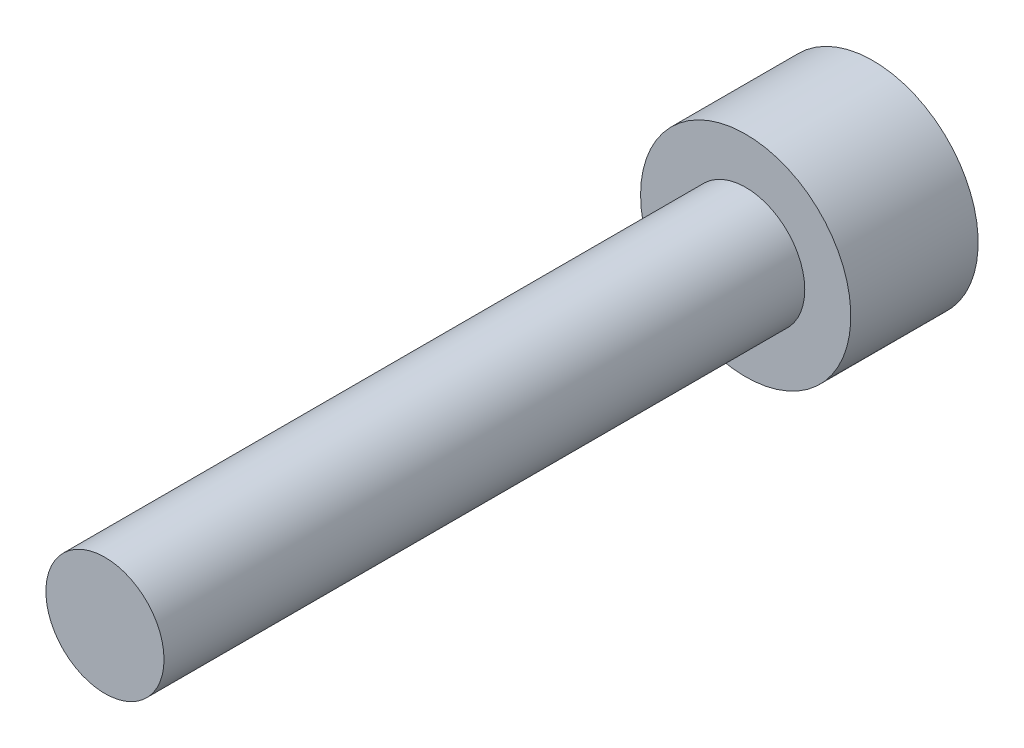
ISO-10303-21;
HEADER;
FILE_DESCRIPTION(('STEP AP214'),'2;1');
FILE_NAME('part.step','',(''),(''),'','','');
FILE_SCHEMA(('AUTOMOTIVE_DESIGN { 1 0 10303 214 1 1 1 1 }'));
ENDSEC;
DATA;
#1=APPLICATION_CONTEXT('core data for automotive mechanical design processes');
#2=APPLICATION_PROTOCOL_DEFINITION('international standard','automotive_design',2000,#1);
#3=PRODUCT_CONTEXT('',#1,'mechanical');
#4=PRODUCT('Part','Part','',(#3));
#5=PRODUCT_RELATED_PRODUCT_CATEGORY('part','',(#4));
#6=PRODUCT_DEFINITION_FORMATION('','',#4);
#7=PRODUCT_DEFINITION_CONTEXT('part definition',#1,'design');
#8=PRODUCT_DEFINITION('design','',#6,#7);
#9=PRODUCT_DEFINITION_SHAPE('','',#8);
#10=(LENGTH_UNIT() NAMED_UNIT(*) SI_UNIT(.MILLI.,.METRE.));
#11=(NAMED_UNIT(*) PLANE_ANGLE_UNIT() SI_UNIT($,.RADIAN.));
#12=(NAMED_UNIT(*) SI_UNIT($,.STERADIAN.) SOLID_ANGLE_UNIT());
#13=UNCERTAINTY_MEASURE_WITH_UNIT(LENGTH_MEASURE(1.E-05),#10,'distance_accuracy_value','');
#14=(GEOMETRIC_REPRESENTATION_CONTEXT(3) GLOBAL_UNCERTAINTY_ASSIGNED_CONTEXT((#13)) GLOBAL_UNIT_ASSIGNED_CONTEXT((#10,
#11,#12)) REPRESENTATION_CONTEXT('',''));
#15=CARTESIAN_POINT('',(0.,0.,0.));
#16=DIRECTION('',(0.,0.,1.));
#17=DIRECTION('',(1.,0.,0.));
#18=AXIS2_PLACEMENT_3D('',#15,#16,#17);
#19=CARTESIAN_POINT('',(0.,0.,3.18));
#20=DIRECTION('',(0.,0.,-1.));
#21=DIRECTION('',(-1.,0.,0.));
#22=AXIS2_PLACEMENT_3D('',#19,#20,#21);
#23=CYLINDRICAL_SURFACE('',#22,2.625);
#24=CARTESIAN_POINT('',(0.,0.,3.18));
#25=DIRECTION('',(0.,0.,1.));
#26=DIRECTION('',(1.,0.,0.));
#27=AXIS2_PLACEMENT_3D('',#24,#25,#26);
#28=CIRCLE('',#27,2.625);
#29=CARTESIAN_POINT('',(-2.625,0.,3.18));
#30=VERTEX_POINT('',#29);
#31=EDGE_CURVE('E42',#30,#30,#28,.T.);
#32=CARTESIAN_POINT('',(0.,0.,0.));
#33=DIRECTION('',(0.,0.,1.));
#34=DIRECTION('',(1.,0.,0.));
#35=AXIS2_PLACEMENT_3D('',#32,#33,#34);
#36=CIRCLE('',#35,2.625);
#37=CARTESIAN_POINT('',(-2.625,0.,0.));
#38=VERTEX_POINT('',#37);
#39=EDGE_CURVE('E38',#38,#38,#36,.T.);
#40=CARTESIAN_POINT('',(-2.625,0.,3.18));
#41=CARTESIAN_POINT('',(-2.625,0.,3.146875));
#42=CARTESIAN_POINT('',(-2.625,0.,3.11375));
#43=CARTESIAN_POINT('',(-2.625,0.,3.0475));
#44=CARTESIAN_POINT('',(-2.625,0.,3.014375));
#45=CARTESIAN_POINT('',(-2.625,0.,2.948125));
#46=CARTESIAN_POINT('',(-2.625,0.,2.915));
#47=CARTESIAN_POINT('',(-2.625,0.,2.84875));
#48=CARTESIAN_POINT('',(-2.625,0.,2.815625));
#49=CARTESIAN_POINT('',(-2.625,0.,2.749375));
#50=CARTESIAN_POINT('',(-2.625,0.,2.71625));
#51=CARTESIAN_POINT('',(-2.625,0.,2.65));
#52=CARTESIAN_POINT('',(-2.625,0.,2.616875));
#53=CARTESIAN_POINT('',(-2.625,0.,2.550625));
#54=CARTESIAN_POINT('',(-2.625,0.,2.5175));
#55=CARTESIAN_POINT('',(-2.625,0.,2.45125));
#56=CARTESIAN_POINT('',(-2.625,0.,2.418125));
#57=CARTESIAN_POINT('',(-2.625,0.,2.351875));
#58=CARTESIAN_POINT('',(-2.625,0.,2.31875));
#59=CARTESIAN_POINT('',(-2.625,0.,2.2525));
#60=CARTESIAN_POINT('',(-2.625,0.,2.219375));
#61=CARTESIAN_POINT('',(-2.625,0.,2.153125));
#62=CARTESIAN_POINT('',(-2.625,0.,2.12));
#63=CARTESIAN_POINT('',(-2.625,0.,2.05375));
#64=CARTESIAN_POINT('',(-2.625,0.,2.020625));
#65=CARTESIAN_POINT('',(-2.625,0.,1.954375));
#66=CARTESIAN_POINT('',(-2.625,0.,1.92125));
#67=CARTESIAN_POINT('',(-2.625,0.,1.855));
#68=CARTESIAN_POINT('',(-2.625,0.,1.821875));
#69=CARTESIAN_POINT('',(-2.625,0.,1.755625));
#70=CARTESIAN_POINT('',(-2.625,0.,1.7225));
#71=CARTESIAN_POINT('',(-2.625,0.,1.65625));
#72=CARTESIAN_POINT('',(-2.625,0.,1.623125));
#73=CARTESIAN_POINT('',(-2.625,0.,1.556875));
#74=CARTESIAN_POINT('',(-2.625,0.,1.52375));
#75=CARTESIAN_POINT('',(-2.625,0.,1.4575));
#76=CARTESIAN_POINT('',(-2.625,0.,1.424375));
#77=CARTESIAN_POINT('',(-2.625,0.,1.358125));
#78=CARTESIAN_POINT('',(-2.625,0.,1.325));
#79=CARTESIAN_POINT('',(-2.625,0.,1.25875));
#80=CARTESIAN_POINT('',(-2.625,0.,1.225625));
#81=CARTESIAN_POINT('',(-2.625,0.,1.159375));
#82=CARTESIAN_POINT('',(-2.625,0.,1.12625));
#83=CARTESIAN_POINT('',(-2.625,0.,1.06));
#84=CARTESIAN_POINT('',(-2.625,0.,1.026875));
#85=CARTESIAN_POINT('',(-2.625,0.,0.960625));
#86=CARTESIAN_POINT('',(-2.625,0.,0.9275));
#87=CARTESIAN_POINT('',(-2.625,0.,0.86125));
#88=CARTESIAN_POINT('',(-2.625,0.,0.828125));
#89=CARTESIAN_POINT('',(-2.625,0.,0.761875));
#90=CARTESIAN_POINT('',(-2.625,0.,0.72875));
#91=CARTESIAN_POINT('',(-2.625,0.,0.6625));
#92=CARTESIAN_POINT('',(-2.625,0.,0.629375));
#93=CARTESIAN_POINT('',(-2.625,0.,0.563125));
#94=CARTESIAN_POINT('',(-2.625,0.,0.53));
#95=CARTESIAN_POINT('',(-2.625,0.,0.46375));
#96=CARTESIAN_POINT('',(-2.625,0.,0.430625));
#97=CARTESIAN_POINT('',(-2.625,0.,0.364375));
#98=CARTESIAN_POINT('',(-2.625,0.,0.33125));
#99=CARTESIAN_POINT('',(-2.625,0.,0.265));
#100=CARTESIAN_POINT('',(-2.625,0.,0.231875));
#101=CARTESIAN_POINT('',(-2.625,0.,0.165625));
#102=CARTESIAN_POINT('',(-2.625,0.,0.1325));
#103=CARTESIAN_POINT('',(-2.625,0.,0.06625));
#104=CARTESIAN_POINT('',(-2.625,0.,0.033125));
#105=CARTESIAN_POINT('',(-2.625,0.,0.));
#106=B_SPLINE_CURVE_WITH_KNOTS('',3,(#40,#41,#42,#43,#44,#45,#46,#47,#48,#49,#50,#51,#52,#53,
#54,#55,#56,#57,#58,#59,#60,#61,#62,#63,#64,#65,#66,#67,#68,#69,#70,#71,#72,#73,#74,#75,#76,#77,
#78,#79,#80,#81,#82,#83,#84,#85,#86,#87,#88,#89,#90,#91,#92,#93,#94,#95,#96,#97,#98,#99,#100,
#101,#102,#103,#104,#105),.UNSPECIFIED.,.F.,.F.,(4,2,2,2,2,2,2,2,2,2,2,2,2,2,2,2,2,2,2,2,2,2,2,
2,2,2,2,2,2,2,2,2,4),(0.,0.0993749999999996,0.19875,0.298125,0.3975,0.496875,0.59625,0.695625,
0.795,0.894375,0.99375,1.093125,1.1925,1.291875,1.39125,1.490625,1.59,1.689375,1.78875,1.888125,
1.9875,2.086875,2.18625,2.285625,2.385,2.484375,2.58375,2.683125,2.7825,2.881875,2.98125,
3.080625,3.18),.UNSPECIFIED.);
#107=EDGE_CURVE('BSEAM35',#30,#38,#106,.T.);
#108=ORIENTED_EDGE('',*,*,#31,.F.);
#109=ORIENTED_EDGE('',*,*,#39,.T.);
#110=ORIENTED_EDGE('',*,*,#107,.T.);
#111=ORIENTED_EDGE('',*,*,#107,.F.);
#112=EDGE_LOOP('',(#108,#110,#109,#111));
#113=FACE_BOUND('',#112,.T.);
#114=ADVANCED_FACE('F35',(#113),#23,.T.);
#115=CARTESIAN_POINT('',(0.,0.,3.18));
#116=DIRECTION('',(0.,0.,1.));
#117=DIRECTION('',(1.,0.,0.));
#118=AXIS2_PLACEMENT_3D('',#115,#116,#117);
#119=PLANE('',#118);
#120=CARTESIAN_POINT('',(0.,0.,3.18));
#121=DIRECTION('',(0.,0.,1.));
#122=DIRECTION('',(1.,0.,0.));
#123=AXIS2_PLACEMENT_3D('',#120,#121,#122);
#124=CIRCLE('',#123,1.475);
#125=CARTESIAN_POINT('',(1.475,0.,3.18));
#126=VERTEX_POINT('',#125);
#127=EDGE_CURVE('E10',#126,#126,#124,.T.);
#128=ORIENTED_EDGE('',*,*,#127,.F.);
#129=EDGE_LOOP('',(#128));
#130=FACE_BOUND('',#129,.T.);
#131=ORIENTED_EDGE('',*,*,#31,.T.);
#132=EDGE_LOOP('',(#131));
#133=FACE_BOUND('',#132,.T.);
#134=ADVANCED_FACE('F59',(#130,#133),#119,.T.);
#135=CARTESIAN_POINT('',(0.,0.,0.));
#136=DIRECTION('',(0.,0.,1.));
#137=DIRECTION('',(1.,0.,0.));
#138=AXIS2_PLACEMENT_3D('',#135,#136,#137);
#139=PLANE('',#138);
#140=ORIENTED_EDGE('',*,*,#39,.F.);
#141=EDGE_LOOP('',(#140));
#142=FACE_BOUND('',#141,.T.);
#143=ADVANCED_FACE('F56',(#142),#139,.F.);
#144=CARTESIAN_POINT('',(0.,0.,19.18));
#145=DIRECTION('',(0.,0.,-1.));
#146=DIRECTION('',(-1.,0.,0.));
#147=AXIS2_PLACEMENT_3D('',#144,#145,#146);
#148=CYLINDRICAL_SURFACE('',#147,1.475);
#149=CARTESIAN_POINT('',(0.,0.,19.18));
#150=DIRECTION('',(0.,0.,1.));
#151=DIRECTION('',(1.,0.,0.));
#152=AXIS2_PLACEMENT_3D('',#149,#150,#151);
#153=CIRCLE('',#152,1.475);
#154=CARTESIAN_POINT('',(1.475,0.,19.18));
#155=VERTEX_POINT('',#154);
#156=EDGE_CURVE('E48',#155,#155,#153,.T.);
#157=ORIENTED_EDGE('',*,*,#156,.F.);
#158=EDGE_LOOP('',(#157));
#159=FACE_BOUND('',#158,.T.);
#160=ORIENTED_EDGE('',*,*,#127,.T.);
#161=EDGE_LOOP('',(#160));
#162=FACE_BOUND('',#161,.T.);
#163=ADVANCED_FACE('F58',(#159,#162),#148,.T.);
#164=CARTESIAN_POINT('',(0.,0.,19.18));
#165=DIRECTION('',(0.,0.,1.));
#166=DIRECTION('',(1.,0.,0.));
#167=AXIS2_PLACEMENT_3D('',#164,#165,#166);
#168=PLANE('',#167);
#169=ORIENTED_EDGE('',*,*,#156,.T.);
#170=EDGE_LOOP('',(#169));
#171=FACE_BOUND('',#170,.T.);
#172=ADVANCED_FACE('F64',(#171),#168,.T.);
#173=CLOSED_SHELL('',(#114,#134,#143,#163,#172));
#174=MANIFOLD_SOLID_BREP('B2',#173);
#175=ADVANCED_BREP_SHAPE_REPRESENTATION('',(#18,#174),#14);
#176=SHAPE_DEFINITION_REPRESENTATION(#9,#175);
ENDSEC;
END-ISO-10303-21;
